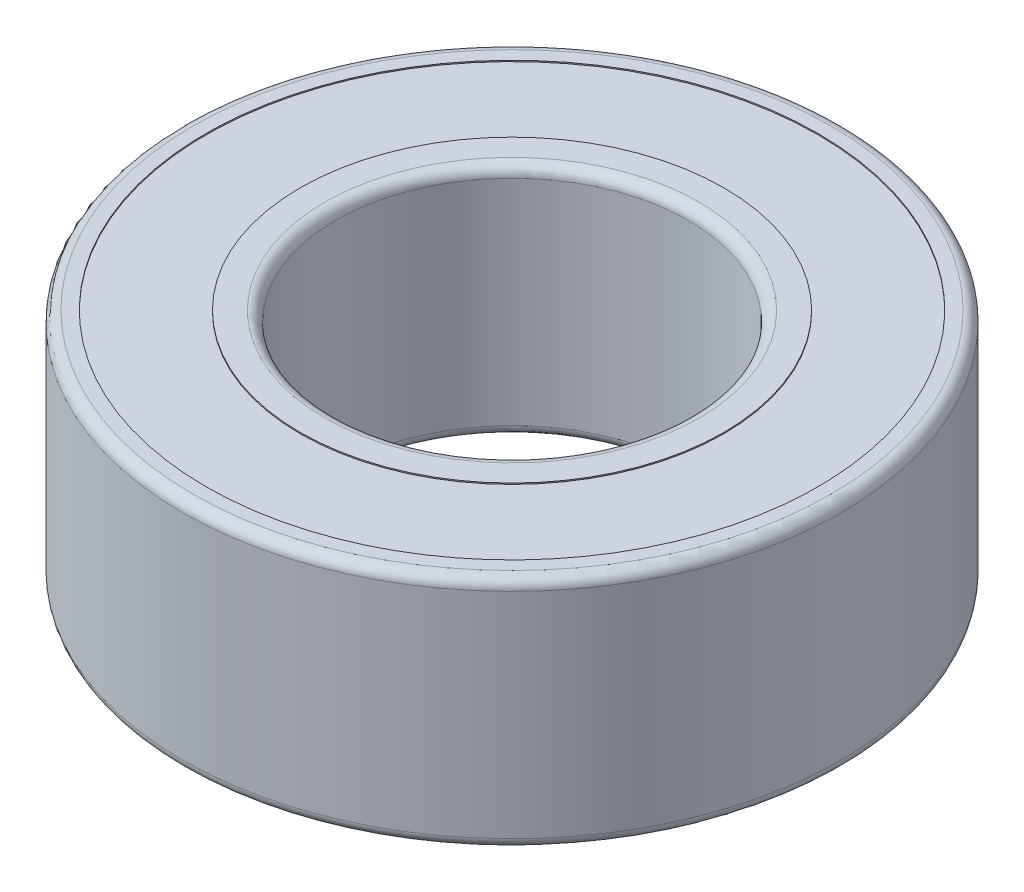
ISO-10303-21;
HEADER;
FILE_DESCRIPTION(('STEP AP214'),'2;1');
FILE_NAME('part.step','',(''),(''),'','','');
FILE_SCHEMA(('AUTOMOTIVE_DESIGN { 1 0 10303 214 1 1 1 1 }'));
ENDSEC;
DATA;
#1=APPLICATION_CONTEXT('core data for automotive mechanical design processes');
#2=APPLICATION_PROTOCOL_DEFINITION('international standard','automotive_design',2000,#1);
#3=PRODUCT_CONTEXT('',#1,'mechanical');
#4=PRODUCT('Part','Part','',(#3));
#5=PRODUCT_RELATED_PRODUCT_CATEGORY('part','',(#4));
#6=PRODUCT_DEFINITION_FORMATION('','',#4);
#7=PRODUCT_DEFINITION_CONTEXT('part definition',#1,'design');
#8=PRODUCT_DEFINITION('design','',#6,#7);
#9=PRODUCT_DEFINITION_SHAPE('','',#8);
#10=(LENGTH_UNIT() NAMED_UNIT(*) SI_UNIT(.MILLI.,.METRE.));
#11=(NAMED_UNIT(*) PLANE_ANGLE_UNIT() SI_UNIT($,.RADIAN.));
#12=(NAMED_UNIT(*) SI_UNIT($,.STERADIAN.) SOLID_ANGLE_UNIT());
#13=UNCERTAINTY_MEASURE_WITH_UNIT(LENGTH_MEASURE(1.E-05),#10,'distance_accuracy_value','');
#14=(GEOMETRIC_REPRESENTATION_CONTEXT(3) GLOBAL_UNCERTAINTY_ASSIGNED_CONTEXT((#13)) GLOBAL_UNIT_ASSIGNED_CONTEXT((#10,
#11,#12)) REPRESENTATION_CONTEXT('',''));
#15=CARTESIAN_POINT('',(0.,0.,0.));
#16=DIRECTION('',(0.,0.,1.));
#17=DIRECTION('',(1.,0.,0.));
#18=AXIS2_PLACEMENT_3D('',#15,#16,#17);
#19=CARTESIAN_POINT('',(0.,-5.,0.));
#20=DIRECTION('',(0.,1.,0.));
#21=DIRECTION('',(0.,0.,1.));
#22=AXIS2_PLACEMENT_3D('',#19,#20,#21);
#23=PLANE('',#22);
#24=CARTESIAN_POINT('',(0.,-5.,0.));
#25=DIRECTION('',(0.,1.,0.));
#26=DIRECTION('',(0.,0.,1.));
#27=AXIS2_PLACEMENT_3D('',#24,#25,#26);
#28=CIRCLE('',#27,7.95);
#29=CARTESIAN_POINT('',(0.,-5.,7.95));
#30=VERTEX_POINT('',#29);
#31=EDGE_CURVE('E86',#30,#30,#28,.T.);
#32=ORIENTED_EDGE('',*,*,#31,.T.);
#33=EDGE_LOOP('',(#32));
#34=FACE_BOUND('',#33,.T.);
#35=CARTESIAN_POINT('',(0.,-5.,0.));
#36=DIRECTION('',(0.,1.,0.));
#37=DIRECTION('',(0.,0.,1.));
#38=AXIS2_PLACEMENT_3D('',#35,#36,#37);
#39=CIRCLE('',#38,9.);
#40=CARTESIAN_POINT('',(0.,-5.,9.));
#41=VERTEX_POINT('',#40);
#42=EDGE_CURVE('E115',#41,#41,#39,.T.);
#43=ORIENTED_EDGE('',*,*,#42,.F.);
#44=EDGE_LOOP('',(#43));
#45=FACE_BOUND('',#44,.T.);
#46=ADVANCED_FACE('F50',(#34,#45),#23,.F.);
#47=CARTESIAN_POINT('',(0.,5.,0.));
#48=DIRECTION('',(0.,1.,0.));
#49=DIRECTION('',(0.,0.,1.));
#50=AXIS2_PLACEMENT_3D('',#47,#48,#49);
#51=PLANE('',#50);
#52=CARTESIAN_POINT('',(0.,5.,0.));
#53=DIRECTION('',(0.,1.,0.));
#54=DIRECTION('',(0.,0.,1.));
#55=AXIS2_PLACEMENT_3D('',#52,#53,#54);
#56=CIRCLE('',#55,7.95);
#57=CARTESIAN_POINT('',(0.,5.,7.95));
#58=VERTEX_POINT('',#57);
#59=EDGE_CURVE('E74',#58,#58,#56,.F.);
#60=ORIENTED_EDGE('',*,*,#59,.T.);
#61=EDGE_LOOP('',(#60));
#62=FACE_BOUND('',#61,.T.);
#63=CARTESIAN_POINT('',(0.,5.,0.));
#64=DIRECTION('',(0.,1.,0.));
#65=DIRECTION('',(0.,0.,1.));
#66=AXIS2_PLACEMENT_3D('',#63,#64,#65);
#67=CIRCLE('',#66,9.);
#68=CARTESIAN_POINT('',(0.,5.,9.));
#69=VERTEX_POINT('',#68);
#70=EDGE_CURVE('E99',#69,#69,#67,.T.);
#71=ORIENTED_EDGE('',*,*,#70,.T.);
#72=EDGE_LOOP('',(#71));
#73=FACE_BOUND('',#72,.T.);
#74=ADVANCED_FACE('F134',(#62,#73),#51,.T.);
#75=CARTESIAN_POINT('',(0.,5.,0.));
#76=DIRECTION('',(0.,1.,0.));
#77=DIRECTION('',(0.,0.,1.));
#78=AXIS2_PLACEMENT_3D('',#75,#76,#77);
#79=CIRCLE('',#78,13.55);
#80=CARTESIAN_POINT('',(0.,5.,13.55));
#81=VERTEX_POINT('',#80);
#82=EDGE_CURVE('E10',#81,#81,#79,.T.);
#83=ORIENTED_EDGE('',*,*,#82,.T.);
#84=EDGE_LOOP('',(#83));
#85=FACE_BOUND('',#84,.T.);
#86=CARTESIAN_POINT('',(0.,5.,0.));
#87=DIRECTION('',(0.,1.,0.));
#88=DIRECTION('',(0.,0.,1.));
#89=AXIS2_PLACEMENT_3D('',#86,#87,#88);
#90=CIRCLE('',#89,13.);
#91=CARTESIAN_POINT('',(0.,5.,13.));
#92=VERTEX_POINT('',#91);
#93=EDGE_CURVE('E91',#92,#92,#90,.T.);
#94=ORIENTED_EDGE('',*,*,#93,.F.);
#95=EDGE_LOOP('',(#94));
#96=FACE_BOUND('',#95,.T.);
#97=ADVANCED_FACE('F141',(#85,#96),#51,.T.);
#98=CARTESIAN_POINT('',(0.,-5.,0.));
#99=DIRECTION('',(0.,1.,0.));
#100=DIRECTION('',(0.,0.,1.));
#101=AXIS2_PLACEMENT_3D('',#98,#99,#100);
#102=CIRCLE('',#101,13.55);
#103=CARTESIAN_POINT('',(0.,-5.,13.55));
#104=VERTEX_POINT('',#103);
#105=EDGE_CURVE('E58',#104,#104,#102,.F.);
#106=ORIENTED_EDGE('',*,*,#105,.T.);
#107=EDGE_LOOP('',(#106));
#108=FACE_BOUND('',#107,.T.);
#109=CARTESIAN_POINT('',(0.,-5.,0.));
#110=DIRECTION('',(0.,1.,0.));
#111=DIRECTION('',(0.,0.,1.));
#112=AXIS2_PLACEMENT_3D('',#109,#110,#111);
#113=CIRCLE('',#112,13.);
#114=CARTESIAN_POINT('',(0.,-5.,13.));
#115=VERTEX_POINT('',#114);
#116=EDGE_CURVE('E107',#115,#115,#113,.T.);
#117=ORIENTED_EDGE('',*,*,#116,.T.);
#118=EDGE_LOOP('',(#117));
#119=FACE_BOUND('',#118,.T.);
#120=ADVANCED_FACE('F137',(#108,#119),#23,.F.);
#121=CARTESIAN_POINT('',(0.,5.,0.));
#122=DIRECTION('',(0.,-1.,0.));
#123=DIRECTION('',(0.,0.,-1.));
#124=AXIS2_PLACEMENT_3D('',#121,#122,#123);
#125=CYLINDRICAL_SURFACE('',#124,14.);
#126=CARTESIAN_POINT('',(0.,-4.55,0.));
#127=DIRECTION('',(0.,1.,0.));
#128=DIRECTION('',(0.,0.,1.));
#129=AXIS2_PLACEMENT_3D('',#126,#127,#128);
#130=CIRCLE('',#129,14.);
#131=CARTESIAN_POINT('',(0.,-4.55,14.));
#132=VERTEX_POINT('',#131);
#133=EDGE_CURVE('E63',#132,#132,#130,.T.);
#134=ORIENTED_EDGE('',*,*,#133,.T.);
#135=EDGE_LOOP('',(#134));
#136=FACE_BOUND('',#135,.T.);
#137=CARTESIAN_POINT('',(0.,4.55,0.));
#138=DIRECTION('',(0.,1.,0.));
#139=DIRECTION('',(0.,0.,1.));
#140=AXIS2_PLACEMENT_3D('',#137,#138,#139);
#141=CIRCLE('',#140,14.);
#142=CARTESIAN_POINT('',(0.,4.55,14.));
#143=VERTEX_POINT('',#142);
#144=EDGE_CURVE('E68',#143,#143,#141,.F.);
#145=ORIENTED_EDGE('',*,*,#144,.T.);
#146=EDGE_LOOP('',(#145));
#147=FACE_BOUND('',#146,.T.);
#148=ADVANCED_FACE('F146',(#136,#147),#125,.T.);
#149=CARTESIAN_POINT('',(0.,5.,0.));
#150=DIRECTION('',(0.,-1.,0.));
#151=DIRECTION('',(0.,0.,-1.));
#152=AXIS2_PLACEMENT_3D('',#149,#150,#151);
#153=CYLINDRICAL_SURFACE('',#152,7.5);
#154=CARTESIAN_POINT('',(0.,-4.55,0.));
#155=DIRECTION('',(0.,1.,0.));
#156=DIRECTION('',(0.,0.,1.));
#157=AXIS2_PLACEMENT_3D('',#154,#155,#156);
#158=CIRCLE('',#157,7.5);
#159=CARTESIAN_POINT('',(0.,-4.55,7.5));
#160=VERTEX_POINT('',#159);
#161=EDGE_CURVE('E78',#160,#160,#158,.F.);
#162=ORIENTED_EDGE('',*,*,#161,.T.);
#163=EDGE_LOOP('',(#162));
#164=FACE_BOUND('',#163,.T.);
#165=CARTESIAN_POINT('',(0.,4.55,0.));
#166=DIRECTION('',(0.,1.,0.));
#167=DIRECTION('',(0.,0.,1.));
#168=AXIS2_PLACEMENT_3D('',#165,#166,#167);
#169=CIRCLE('',#168,7.5);
#170=CARTESIAN_POINT('',(0.,4.55,7.5));
#171=VERTEX_POINT('',#170);
#172=EDGE_CURVE('E82',#171,#171,#169,.T.);
#173=ORIENTED_EDGE('',*,*,#172,.T.);
#174=EDGE_LOOP('',(#173));
#175=FACE_BOUND('',#174,.T.);
#176=ADVANCED_FACE('F151',(#164,#175),#153,.F.);
#177=CARTESIAN_POINT('',(0.,4.95,0.));
#178=DIRECTION('',(0.,1.,0.));
#179=DIRECTION('',(0.,0.,1.));
#180=AXIS2_PLACEMENT_3D('',#177,#178,#179);
#181=CYLINDRICAL_SURFACE('',#180,13.);
#182=CARTESIAN_POINT('',(0.,4.95,0.));
#183=DIRECTION('',(0.,1.,0.));
#184=DIRECTION('',(0.,0.,1.));
#185=AXIS2_PLACEMENT_3D('',#182,#183,#184);
#186=CIRCLE('',#185,13.);
#187=CARTESIAN_POINT('',(0.,4.95,13.));
#188=VERTEX_POINT('',#187);
#189=EDGE_CURVE('E90',#188,#188,#186,.T.);
#190=ORIENTED_EDGE('',*,*,#189,.F.);
#191=EDGE_LOOP('',(#190));
#192=FACE_BOUND('',#191,.T.);
#193=ORIENTED_EDGE('',*,*,#93,.T.);
#194=EDGE_LOOP('',(#193));
#195=FACE_BOUND('',#194,.T.);
#196=ADVANCED_FACE('F173',(#192,#195),#181,.F.);
#197=CARTESIAN_POINT('',(0.,4.95,0.));
#198=DIRECTION('',(0.,1.,0.));
#199=DIRECTION('',(0.,0.,1.));
#200=AXIS2_PLACEMENT_3D('',#197,#198,#199);
#201=PLANE('',#200);
#202=CARTESIAN_POINT('',(0.,4.95,0.));
#203=DIRECTION('',(0.,1.,0.));
#204=DIRECTION('',(0.,0.,1.));
#205=AXIS2_PLACEMENT_3D('',#202,#203,#204);
#206=CIRCLE('',#205,9.);
#207=CARTESIAN_POINT('',(0.,4.95,9.));
#208=VERTEX_POINT('',#207);
#209=EDGE_CURVE('E95',#208,#208,#206,.T.);
#210=ORIENTED_EDGE('',*,*,#209,.F.);
#211=EDGE_LOOP('',(#210));
#212=FACE_BOUND('',#211,.T.);
#213=ORIENTED_EDGE('',*,*,#189,.T.);
#214=EDGE_LOOP('',(#213));
#215=FACE_BOUND('',#214,.T.);
#216=ADVANCED_FACE('F169',(#212,#215),#201,.T.);
#217=CARTESIAN_POINT('',(0.,4.95,0.));
#218=DIRECTION('',(0.,1.,0.));
#219=DIRECTION('',(0.,0.,1.));
#220=AXIS2_PLACEMENT_3D('',#217,#218,#219);
#221=CYLINDRICAL_SURFACE('',#220,9.);
#222=ORIENTED_EDGE('',*,*,#209,.T.);
#223=EDGE_LOOP('',(#222));
#224=FACE_BOUND('',#223,.T.);
#225=ORIENTED_EDGE('',*,*,#70,.F.);
#226=EDGE_LOOP('',(#225));
#227=FACE_BOUND('',#226,.T.);
#228=ADVANCED_FACE('F163',(#224,#227),#221,.T.);
#229=CARTESIAN_POINT('',(0.,-4.95,0.));
#230=DIRECTION('',(0.,-1.,0.));
#231=DIRECTION('',(0.,0.,1.));
#232=AXIS2_PLACEMENT_3D('',#229,#230,#231);
#233=PLANE('',#232);
#234=CARTESIAN_POINT('',(0.,-4.95,0.));
#235=DIRECTION('',(0.,1.,0.));
#236=DIRECTION('',(0.,0.,1.));
#237=AXIS2_PLACEMENT_3D('',#234,#235,#236);
#238=CIRCLE('',#237,13.);
#239=CARTESIAN_POINT('',(0.,-4.95,13.));
#240=VERTEX_POINT('',#239);
#241=EDGE_CURVE('E103',#240,#240,#238,.T.);
#242=ORIENTED_EDGE('',*,*,#241,.F.);
#243=EDGE_LOOP('',(#242));
#244=FACE_BOUND('',#243,.T.);
#245=CARTESIAN_POINT('',(0.,-4.95,0.));
#246=DIRECTION('',(0.,1.,0.));
#247=DIRECTION('',(0.,0.,1.));
#248=AXIS2_PLACEMENT_3D('',#245,#246,#247);
#249=CIRCLE('',#248,9.);
#250=CARTESIAN_POINT('',(0.,-4.95,9.));
#251=VERTEX_POINT('',#250);
#252=EDGE_CURVE('E111',#251,#251,#249,.T.);
#253=ORIENTED_EDGE('',*,*,#252,.T.);
#254=EDGE_LOOP('',(#253));
#255=FACE_BOUND('',#254,.T.);
#256=ADVANCED_FACE('F123',(#244,#255),#233,.T.);
#257=CARTESIAN_POINT('',(0.,-4.95,0.));
#258=DIRECTION('',(0.,-1.,0.));
#259=DIRECTION('',(0.,0.,-1.));
#260=AXIS2_PLACEMENT_3D('',#257,#258,#259);
#261=CYLINDRICAL_SURFACE('',#260,13.);
#262=ORIENTED_EDGE('',*,*,#241,.T.);
#263=EDGE_LOOP('',(#262));
#264=FACE_BOUND('',#263,.T.);
#265=ORIENTED_EDGE('',*,*,#116,.F.);
#266=EDGE_LOOP('',(#265));
#267=FACE_BOUND('',#266,.T.);
#268=ADVANCED_FACE('F129',(#264,#267),#261,.F.);
#269=CARTESIAN_POINT('',(0.,-4.95,0.));
#270=DIRECTION('',(0.,-1.,0.));
#271=DIRECTION('',(0.,0.,-1.));
#272=AXIS2_PLACEMENT_3D('',#269,#270,#271);
#273=CYLINDRICAL_SURFACE('',#272,9.);
#274=ORIENTED_EDGE('',*,*,#252,.F.);
#275=EDGE_LOOP('',(#274));
#276=FACE_BOUND('',#275,.T.);
#277=ORIENTED_EDGE('',*,*,#42,.T.);
#278=EDGE_LOOP('',(#277));
#279=FACE_BOUND('',#278,.T.);
#280=ADVANCED_FACE('F125',(#276,#279),#273,.T.);
#281=CARTESIAN_POINT('',(0.,-4.55,0.));
#282=DIRECTION('',(0.,1.,0.));
#283=DIRECTION('',(0.,0.,1.));
#284=AXIS2_PLACEMENT_3D('',#281,#282,#283);
#285=TOROIDAL_SURFACE('',#284,7.95,0.45);
#286=ORIENTED_EDGE('',*,*,#161,.F.);
#287=EDGE_LOOP('',(#286));
#288=FACE_BOUND('',#287,.T.);
#289=ORIENTED_EDGE('',*,*,#31,.F.);
#290=EDGE_LOOP('',(#289));
#291=FACE_BOUND('',#290,.T.);
#292=ADVANCED_FACE('F128',(#288,#291),#285,.T.);
#293=CARTESIAN_POINT('',(0.,4.55,0.));
#294=DIRECTION('',(0.,1.,0.));
#295=DIRECTION('',(0.,0.,1.));
#296=AXIS2_PLACEMENT_3D('',#293,#294,#295);
#297=TOROIDAL_SURFACE('',#296,7.95,0.45);
#298=ORIENTED_EDGE('',*,*,#59,.F.);
#299=EDGE_LOOP('',(#298));
#300=FACE_BOUND('',#299,.T.);
#301=ORIENTED_EDGE('',*,*,#172,.F.);
#302=EDGE_LOOP('',(#301));
#303=FACE_BOUND('',#302,.T.);
#304=ADVANCED_FACE('F187',(#300,#303),#297,.T.);
#305=CARTESIAN_POINT('',(0.,-4.55,0.));
#306=DIRECTION('',(0.,1.,0.));
#307=DIRECTION('',(0.,0.,1.));
#308=AXIS2_PLACEMENT_3D('',#305,#306,#307);
#309=TOROIDAL_SURFACE('',#308,13.55,0.45);
#310=ORIENTED_EDGE('',*,*,#105,.F.);
#311=EDGE_LOOP('',(#310));
#312=FACE_BOUND('',#311,.T.);
#313=ORIENTED_EDGE('',*,*,#133,.F.);
#314=EDGE_LOOP('',(#313));
#315=FACE_BOUND('',#314,.T.);
#316=ADVANCED_FACE('F189',(#312,#315),#309,.T.);
#317=CARTESIAN_POINT('',(0.,4.55,0.));
#318=DIRECTION('',(0.,1.,0.));
#319=DIRECTION('',(0.,0.,1.));
#320=AXIS2_PLACEMENT_3D('',#317,#318,#319);
#321=TOROIDAL_SURFACE('',#320,13.55,0.45);
#322=ORIENTED_EDGE('',*,*,#144,.F.);
#323=EDGE_LOOP('',(#322));
#324=FACE_BOUND('',#323,.T.);
#325=ORIENTED_EDGE('',*,*,#82,.F.);
#326=EDGE_LOOP('',(#325));
#327=FACE_BOUND('',#326,.T.);
#328=ADVANCED_FACE('F52',(#324,#327),#321,.T.);
#329=CLOSED_SHELL('',(#46,#74,#97,#120,#148,#176,#196,#216,#228,#256,#268,#280,#292,#304,#316,#328));
#330=MANIFOLD_SOLID_BREP('B2',#329);
#331=ADVANCED_BREP_SHAPE_REPRESENTATION('',(#18,#330),#14);
#332=SHAPE_DEFINITION_REPRESENTATION(#9,#331);
ENDSEC;
END-ISO-10303-21;
